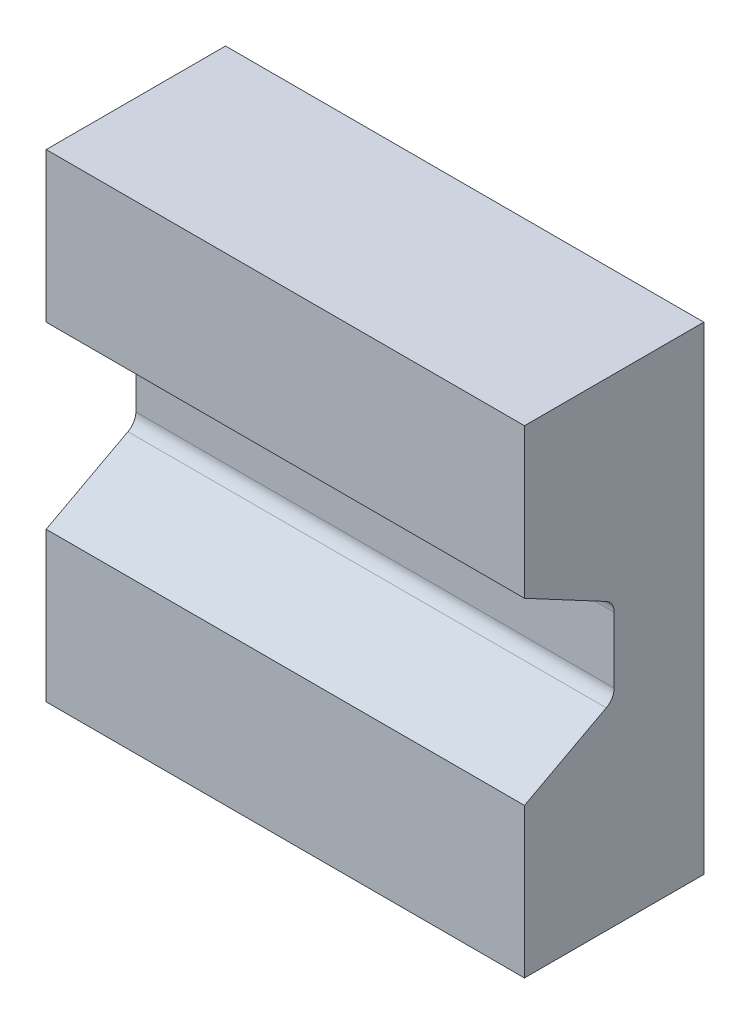
ISO-10303-21;
HEADER;
FILE_DESCRIPTION(('STEP AP214'),'2;1');
FILE_NAME('part.step','',(''),(''),'','','');
FILE_SCHEMA(('AUTOMOTIVE_DESIGN { 1 0 10303 214 1 1 1 1 }'));
ENDSEC;
DATA;
#1=APPLICATION_CONTEXT('core data for automotive mechanical design processes');
#2=APPLICATION_PROTOCOL_DEFINITION('international standard','automotive_design',2000,#1);
#3=PRODUCT_CONTEXT('',#1,'mechanical');
#4=PRODUCT('Part','Part','',(#3));
#5=PRODUCT_RELATED_PRODUCT_CATEGORY('part','',(#4));
#6=PRODUCT_DEFINITION_FORMATION('','',#4);
#7=PRODUCT_DEFINITION_CONTEXT('part definition',#1,'design');
#8=PRODUCT_DEFINITION('design','',#6,#7);
#9=PRODUCT_DEFINITION_SHAPE('','',#8);
#10=(LENGTH_UNIT() NAMED_UNIT(*) SI_UNIT(.MILLI.,.METRE.));
#11=(NAMED_UNIT(*) PLANE_ANGLE_UNIT() SI_UNIT($,.RADIAN.));
#12=(NAMED_UNIT(*) SI_UNIT($,.STERADIAN.) SOLID_ANGLE_UNIT());
#13=UNCERTAINTY_MEASURE_WITH_UNIT(LENGTH_MEASURE(1.E-05),#10,'distance_accuracy_value','');
#14=(GEOMETRIC_REPRESENTATION_CONTEXT(3) GLOBAL_UNCERTAINTY_ASSIGNED_CONTEXT((#13)) GLOBAL_UNIT_ASSIGNED_CONTEXT((#10,
#11,#12)) REPRESENTATION_CONTEXT('',''));
#15=CARTESIAN_POINT('',(0.,0.,0.));
#16=DIRECTION('',(0.,0.,1.));
#17=DIRECTION('',(1.,0.,0.));
#18=AXIS2_PLACEMENT_3D('',#15,#16,#17);
#19=CARTESIAN_POINT('',(-40.,-40.,30.));
#20=DIRECTION('',(0.,0.,1.));
#21=DIRECTION('',(1.,0.,0.));
#22=AXIS2_PLACEMENT_3D('',#19,#20,#21);
#23=PLANE('',#22);
#24=DIRECTION('',(1.,0.,0.));
#25=VECTOR('',#24,1.);
#26=CARTESIAN_POINT('',(-40.,15.,30.));
#27=LINE('',#26,#25);
#28=CARTESIAN_POINT('',(-40.,15.,30.));
#29=VERTEX_POINT('',#28);
#30=CARTESIAN_POINT('',(40.,15.,30.));
#31=VERTEX_POINT('',#30);
#32=EDGE_CURVE('E156',#29,#31,#27,.T.);
#33=ORIENTED_EDGE('',*,*,#32,.T.);
#34=DIRECTION('',(0.,1.,0.));
#35=VECTOR('',#34,1.);
#36=CARTESIAN_POINT('',(40.,40.,30.));
#37=LINE('',#36,#35);
#38=CARTESIAN_POINT('',(40.,40.,30.));
#39=VERTEX_POINT('',#38);
#40=EDGE_CURVE('E170',#31,#39,#37,.T.);
#41=ORIENTED_EDGE('',*,*,#40,.T.);
#42=DIRECTION('',(-1.,0.,0.));
#43=VECTOR('',#42,1.);
#44=CARTESIAN_POINT('',(-40.,40.,30.));
#45=LINE('',#44,#43);
#46=CARTESIAN_POINT('',(-40.,40.,30.));
#47=VERTEX_POINT('',#46);
#48=EDGE_CURVE('E55',#39,#47,#45,.T.);
#49=ORIENTED_EDGE('',*,*,#48,.T.);
#50=DIRECTION('',(0.,-1.,0.));
#51=VECTOR('',#50,1.);
#52=CARTESIAN_POINT('',(-40.,40.,30.));
#53=LINE('',#52,#51);
#54=EDGE_CURVE('E166',#47,#29,#53,.T.);
#55=ORIENTED_EDGE('',*,*,#54,.T.);
#56=EDGE_LOOP('',(#33,#41,#49,#55));
#57=FACE_BOUND('',#56,.T.);
#58=ADVANCED_FACE('F31',(#57),#23,.T.);
#59=CARTESIAN_POINT('',(-40.,40.,30.));
#60=DIRECTION('',(1.,0.,0.));
#61=DIRECTION('',(0.,1.,0.));
#62=AXIS2_PLACEMENT_3D('',#59,#60,#61);
#63=PLANE('',#62);
#64=CARTESIAN_POINT('',(-40.,5.49999999999999,17.5));
#65=DIRECTION('',(1.,0.,0.));
#66=DIRECTION('',(0.,1.,0.));
#67=AXIS2_PLACEMENT_3D('',#64,#65,#66);
#68=CIRCLE('',#67,2.5);
#69=CARTESIAN_POINT('',(-40.,5.49999999999999,15.));
#70=VERTEX_POINT('',#69);
#71=CARTESIAN_POINT('',(-40.,7.70588235294117,16.3235294117647));
#72=VERTEX_POINT('',#71);
#73=EDGE_CURVE('E143',#70,#72,#68,.T.);
#74=ORIENTED_EDGE('',*,*,#73,.T.);
#75=DIRECTION('',(0.,0.470588235294118,0.882352941176471));
#76=VECTOR('',#75,1.);
#77=CARTESIAN_POINT('',(-40.,15.,30.));
#78=LINE('',#77,#76);
#79=EDGE_CURVE('E145',#72,#29,#78,.T.);
#80=ORIENTED_EDGE('',*,*,#79,.T.);
#81=ORIENTED_EDGE('',*,*,#54,.F.);
#82=DIRECTION('',(0.,0.,-1.));
#83=VECTOR('',#82,1.);
#84=CARTESIAN_POINT('',(-40.,40.,30.));
#85=LINE('',#84,#83);
#86=CARTESIAN_POINT('',(-40.,40.,0.));
#87=VERTEX_POINT('',#86);
#88=EDGE_CURVE('E175',#47,#87,#85,.T.);
#89=ORIENTED_EDGE('',*,*,#88,.T.);
#90=DIRECTION('',(0.,-1.,0.));
#91=VECTOR('',#90,1.);
#92=CARTESIAN_POINT('',(-40.,40.,0.));
#93=LINE('',#92,#91);
#94=CARTESIAN_POINT('',(-40.,-40.,0.));
#95=VERTEX_POINT('',#94);
#96=EDGE_CURVE('E159',#87,#95,#93,.T.);
#97=ORIENTED_EDGE('',*,*,#96,.T.);
#98=DIRECTION('',(0.,0.,-1.));
#99=VECTOR('',#98,1.);
#100=CARTESIAN_POINT('',(-40.,-40.,30.));
#101=LINE('',#100,#99);
#102=CARTESIAN_POINT('',(-40.,-40.,30.));
#103=VERTEX_POINT('',#102);
#104=EDGE_CURVE('E11',#103,#95,#101,.T.);
#105=ORIENTED_EDGE('',*,*,#104,.F.);
#106=CARTESIAN_POINT('',(-40.,-15.,30.));
#107=VERTEX_POINT('',#106);
#108=EDGE_CURVE('E83',#107,#103,#53,.T.);
#109=ORIENTED_EDGE('',*,*,#108,.F.);
#110=DIRECTION('',(0.,0.470588235294118,-0.88235294117647));
#111=VECTOR('',#110,1.);
#112=CARTESIAN_POINT('',(-40.,-15.,30.));
#113=LINE('',#112,#111);
#114=CARTESIAN_POINT('',(-40.,-7.70588235294119,16.3235294117647));
#115=VERTEX_POINT('',#114);
#116=EDGE_CURVE('E46',#107,#115,#113,.T.);
#117=ORIENTED_EDGE('',*,*,#116,.T.);
#118=CARTESIAN_POINT('',(-40.,-5.50000000000001,17.5));
#119=DIRECTION('',(1.,0.,0.));
#120=DIRECTION('',(0.,-1.,0.));
#121=AXIS2_PLACEMENT_3D('',#118,#119,#120);
#122=CIRCLE('',#121,2.5);
#123=CARTESIAN_POINT('',(-40.,-5.50000000000001,15.));
#124=VERTEX_POINT('',#123);
#125=EDGE_CURVE('E128',#115,#124,#122,.T.);
#126=ORIENTED_EDGE('',*,*,#125,.T.);
#127=DIRECTION('',(0.,1.,0.));
#128=VECTOR('',#127,1.);
#129=CARTESIAN_POINT('',(-40.,5.49999999999999,15.));
#130=LINE('',#129,#128);
#131=EDGE_CURVE('E133',#124,#70,#130,.T.);
#132=ORIENTED_EDGE('',*,*,#131,.T.);
#133=EDGE_LOOP('',(#74,#80,#81,#89,#97,#105,#109,#117,#126,#132));
#134=FACE_BOUND('',#133,.T.);
#135=ADVANCED_FACE('F33',(#134),#63,.F.);
#136=CARTESIAN_POINT('',(-40.,-40.,30.));
#137=DIRECTION('',(0.,1.,0.));
#138=DIRECTION('',(0.,0.,1.));
#139=AXIS2_PLACEMENT_3D('',#136,#137,#138);
#140=PLANE('',#139);
#141=DIRECTION('',(1.,0.,0.));
#142=VECTOR('',#141,1.);
#143=CARTESIAN_POINT('',(-40.,-40.,0.));
#144=LINE('',#143,#142);
#145=CARTESIAN_POINT('',(40.,-40.,0.));
#146=VERTEX_POINT('',#145);
#147=EDGE_CURVE('E178',#95,#146,#144,.T.);
#148=ORIENTED_EDGE('',*,*,#147,.T.);
#149=DIRECTION('',(0.,0.,-1.));
#150=VECTOR('',#149,1.);
#151=CARTESIAN_POINT('',(40.,-40.,30.));
#152=LINE('',#151,#150);
#153=CARTESIAN_POINT('',(40.,-40.,30.));
#154=VERTEX_POINT('',#153);
#155=EDGE_CURVE('E39',#154,#146,#152,.T.);
#156=ORIENTED_EDGE('',*,*,#155,.F.);
#157=DIRECTION('',(1.,0.,0.));
#158=VECTOR('',#157,1.);
#159=CARTESIAN_POINT('',(-40.,-40.,30.));
#160=LINE('',#159,#158);
#161=EDGE_CURVE('E168',#103,#154,#160,.T.);
#162=ORIENTED_EDGE('',*,*,#161,.F.);
#163=ORIENTED_EDGE('',*,*,#104,.T.);
#164=EDGE_LOOP('',(#148,#156,#162,#163));
#165=FACE_BOUND('',#164,.T.);
#166=ADVANCED_FACE('F224',(#165),#140,.F.);
#167=CARTESIAN_POINT('',(40.,40.,30.));
#168=DIRECTION('',(-1.,0.,0.));
#169=DIRECTION('',(0.,-1.,0.));
#170=AXIS2_PLACEMENT_3D('',#167,#168,#169);
#171=PLANE('',#170);
#172=ORIENTED_EDGE('',*,*,#40,.F.);
#173=DIRECTION('',(0.,0.470588235294118,0.882352941176471));
#174=VECTOR('',#173,1.);
#175=CARTESIAN_POINT('',(40.,15.,30.));
#176=LINE('',#175,#174);
#177=CARTESIAN_POINT('',(40.,7.70588235294118,16.3235294117647));
#178=VERTEX_POINT('',#177);
#179=EDGE_CURVE('E137',#178,#31,#176,.T.);
#180=ORIENTED_EDGE('',*,*,#179,.F.);
#181=CARTESIAN_POINT('',(40.,5.5,17.5));
#182=DIRECTION('',(1.,0.,0.));
#183=DIRECTION('',(0.,1.,0.));
#184=AXIS2_PLACEMENT_3D('',#181,#182,#183);
#185=CIRCLE('',#184,2.5);
#186=CARTESIAN_POINT('',(40.,5.5,15.));
#187=VERTEX_POINT('',#186);
#188=EDGE_CURVE('E139',#187,#178,#185,.T.);
#189=ORIENTED_EDGE('',*,*,#188,.F.);
#190=DIRECTION('',(0.,1.,0.));
#191=VECTOR('',#190,1.);
#192=CARTESIAN_POINT('',(40.,5.5,15.));
#193=LINE('',#192,#191);
#194=CARTESIAN_POINT('',(40.,-5.5,15.));
#195=VERTEX_POINT('',#194);
#196=EDGE_CURVE('E151',#195,#187,#193,.T.);
#197=ORIENTED_EDGE('',*,*,#196,.F.);
#198=CARTESIAN_POINT('',(40.,-5.5,17.5));
#199=DIRECTION('',(1.,0.,0.));
#200=DIRECTION('',(0.,-1.,0.));
#201=AXIS2_PLACEMENT_3D('',#198,#199,#200);
#202=CIRCLE('',#201,2.5);
#203=CARTESIAN_POINT('',(40.,-7.70588235294117,16.3235294117647));
#204=VERTEX_POINT('',#203);
#205=EDGE_CURVE('E149',#204,#195,#202,.T.);
#206=ORIENTED_EDGE('',*,*,#205,.F.);
#207=DIRECTION('',(0.,0.470588235294118,-0.88235294117647));
#208=VECTOR('',#207,1.);
#209=CARTESIAN_POINT('',(40.,-15.,30.));
#210=LINE('',#209,#208);
#211=CARTESIAN_POINT('',(40.,-15.,30.));
#212=VERTEX_POINT('',#211);
#213=EDGE_CURVE('E120',#212,#204,#210,.T.);
#214=ORIENTED_EDGE('',*,*,#213,.F.);
#215=EDGE_CURVE('E171',#154,#212,#37,.T.);
#216=ORIENTED_EDGE('',*,*,#215,.F.);
#217=ORIENTED_EDGE('',*,*,#155,.T.);
#218=DIRECTION('',(0.,1.,0.));
#219=VECTOR('',#218,1.);
#220=CARTESIAN_POINT('',(40.,40.,0.));
#221=LINE('',#220,#219);
#222=CARTESIAN_POINT('',(40.,40.,0.));
#223=VERTEX_POINT('',#222);
#224=EDGE_CURVE('E180',#146,#223,#221,.T.);
#225=ORIENTED_EDGE('',*,*,#224,.T.);
#226=DIRECTION('',(0.,0.,-1.));
#227=VECTOR('',#226,1.);
#228=CARTESIAN_POINT('',(40.,40.,30.));
#229=LINE('',#228,#227);
#230=EDGE_CURVE('E184',#39,#223,#229,.T.);
#231=ORIENTED_EDGE('',*,*,#230,.F.);
#232=EDGE_LOOP('',(#172,#180,#189,#197,#206,#214,#216,#217,#225,#231));
#233=FACE_BOUND('',#232,.T.);
#234=ADVANCED_FACE('F191',(#233),#171,.F.);
#235=CARTESIAN_POINT('',(-40.,40.,30.));
#236=DIRECTION('',(0.,-1.,0.));
#237=DIRECTION('',(0.,0.,-1.));
#238=AXIS2_PLACEMENT_3D('',#235,#236,#237);
#239=PLANE('',#238);
#240=DIRECTION('',(-1.,0.,0.));
#241=VECTOR('',#240,1.);
#242=CARTESIAN_POINT('',(-40.,40.,0.));
#243=LINE('',#242,#241);
#244=EDGE_CURVE('E76',#223,#87,#243,.T.);
#245=ORIENTED_EDGE('',*,*,#244,.T.);
#246=ORIENTED_EDGE('',*,*,#88,.F.);
#247=ORIENTED_EDGE('',*,*,#48,.F.);
#248=ORIENTED_EDGE('',*,*,#230,.T.);
#249=EDGE_LOOP('',(#245,#246,#247,#248));
#250=FACE_BOUND('',#249,.T.);
#251=ADVANCED_FACE('F198',(#250),#239,.F.);
#252=DIRECTION('',(1.,0.,0.));
#253=VECTOR('',#252,1.);
#254=CARTESIAN_POINT('',(-40.,-15.,30.));
#255=LINE('',#254,#253);
#256=EDGE_CURVE('E125',#107,#212,#255,.T.);
#257=ORIENTED_EDGE('',*,*,#256,.F.);
#258=ORIENTED_EDGE('',*,*,#108,.T.);
#259=ORIENTED_EDGE('',*,*,#161,.T.);
#260=ORIENTED_EDGE('',*,*,#215,.T.);
#261=EDGE_LOOP('',(#257,#258,#259,#260));
#262=FACE_BOUND('',#261,.T.);
#263=ADVANCED_FACE('F220',(#262),#23,.T.);
#264=CARTESIAN_POINT('',(-40.,-40.,0.));
#265=DIRECTION('',(0.,0.,1.));
#266=DIRECTION('',(1.,0.,0.));
#267=AXIS2_PLACEMENT_3D('',#264,#265,#266);
#268=PLANE('',#267);
#269=ORIENTED_EDGE('',*,*,#96,.F.);
#270=ORIENTED_EDGE('',*,*,#244,.F.);
#271=ORIENTED_EDGE('',*,*,#224,.F.);
#272=ORIENTED_EDGE('',*,*,#147,.F.);
#273=EDGE_LOOP('',(#269,#270,#271,#272));
#274=FACE_BOUND('',#273,.T.);
#275=ADVANCED_FACE('F196',(#274),#268,.F.);
#276=CARTESIAN_POINT('',(-40.,15.,30.));
#277=DIRECTION('',(0.,0.88235294117647,-0.470588235294118));
#278=DIRECTION('',(0.,0.470588235294118,0.882352941176471));
#279=AXIS2_PLACEMENT_3D('',#276,#277,#278);
#280=PLANE('',#279);
#281=ORIENTED_EDGE('',*,*,#179,.T.);
#282=ORIENTED_EDGE('',*,*,#32,.F.);
#283=ORIENTED_EDGE('',*,*,#79,.F.);
#284=DIRECTION('',(1.,0.,0.));
#285=VECTOR('',#284,1.);
#286=CARTESIAN_POINT('',(-40.,7.70588235294117,16.3235294117647));
#287=LINE('',#286,#285);
#288=EDGE_CURVE('E160',#72,#178,#287,.T.);
#289=ORIENTED_EDGE('',*,*,#288,.T.);
#290=EDGE_LOOP('',(#281,#282,#283,#289));
#291=FACE_BOUND('',#290,.T.);
#292=ADVANCED_FACE('F203',(#291),#280,.F.);
#293=CARTESIAN_POINT('',(-40.,5.49999999999999,17.5));
#294=DIRECTION('',(1.,0.,0.));
#295=DIRECTION('',(0.,1.,0.));
#296=AXIS2_PLACEMENT_3D('',#293,#294,#295);
#297=CYLINDRICAL_SURFACE('',#296,2.5);
#298=ORIENTED_EDGE('',*,*,#188,.T.);
#299=ORIENTED_EDGE('',*,*,#288,.F.);
#300=ORIENTED_EDGE('',*,*,#73,.F.);
#301=DIRECTION('',(1.,0.,0.));
#302=VECTOR('',#301,1.);
#303=CARTESIAN_POINT('',(-40.,5.49999999999999,15.));
#304=LINE('',#303,#302);
#305=EDGE_CURVE('E162',#70,#187,#304,.T.);
#306=ORIENTED_EDGE('',*,*,#305,.T.);
#307=EDGE_LOOP('',(#298,#299,#300,#306));
#308=FACE_BOUND('',#307,.T.);
#309=ADVANCED_FACE('F206',(#308),#297,.F.);
#310=CARTESIAN_POINT('',(-40.,5.49999999999999,15.));
#311=DIRECTION('',(0.,0.,-1.));
#312=DIRECTION('',(0.,1.,0.));
#313=AXIS2_PLACEMENT_3D('',#310,#311,#312);
#314=PLANE('',#313);
#315=ORIENTED_EDGE('',*,*,#196,.T.);
#316=ORIENTED_EDGE('',*,*,#305,.F.);
#317=ORIENTED_EDGE('',*,*,#131,.F.);
#318=DIRECTION('',(1.,0.,0.));
#319=VECTOR('',#318,1.);
#320=CARTESIAN_POINT('',(-40.,-5.50000000000001,15.));
#321=LINE('',#320,#319);
#322=EDGE_CURVE('E124',#124,#195,#321,.T.);
#323=ORIENTED_EDGE('',*,*,#322,.T.);
#324=EDGE_LOOP('',(#315,#316,#317,#323));
#325=FACE_BOUND('',#324,.T.);
#326=ADVANCED_FACE('F209',(#325),#314,.F.);
#327=CARTESIAN_POINT('',(-40.,-5.50000000000001,17.5));
#328=DIRECTION('',(1.,0.,0.));
#329=DIRECTION('',(0.,1.,0.));
#330=AXIS2_PLACEMENT_3D('',#327,#328,#329);
#331=CYLINDRICAL_SURFACE('',#330,2.5);
#332=ORIENTED_EDGE('',*,*,#205,.T.);
#333=ORIENTED_EDGE('',*,*,#322,.F.);
#334=ORIENTED_EDGE('',*,*,#125,.F.);
#335=DIRECTION('',(1.,0.,0.));
#336=VECTOR('',#335,1.);
#337=CARTESIAN_POINT('',(-40.,-7.70588235294119,16.3235294117647));
#338=LINE('',#337,#336);
#339=EDGE_CURVE('E116',#115,#204,#338,.T.);
#340=ORIENTED_EDGE('',*,*,#339,.T.);
#341=EDGE_LOOP('',(#332,#333,#334,#340));
#342=FACE_BOUND('',#341,.T.);
#343=ADVANCED_FACE('F129',(#342),#331,.F.);
#344=CARTESIAN_POINT('',(-40.,-15.,30.));
#345=DIRECTION('',(0.,-0.88235294117647,-0.470588235294118));
#346=DIRECTION('',(0.,0.470588235294118,-0.88235294117647));
#347=AXIS2_PLACEMENT_3D('',#344,#345,#346);
#348=PLANE('',#347);
#349=ORIENTED_EDGE('',*,*,#213,.T.);
#350=ORIENTED_EDGE('',*,*,#339,.F.);
#351=ORIENTED_EDGE('',*,*,#116,.F.);
#352=ORIENTED_EDGE('',*,*,#256,.T.);
#353=EDGE_LOOP('',(#349,#350,#351,#352));
#354=FACE_BOUND('',#353,.T.);
#355=ADVANCED_FACE('F118',(#354),#348,.F.);
#356=CLOSED_SHELL('',(#58,#135,#166,#234,#251,#263,#275,#292,#309,#326,#343,#355));
#357=MANIFOLD_SOLID_BREP('B2',#356);
#358=ADVANCED_BREP_SHAPE_REPRESENTATION('',(#18,#357),#14);
#359=SHAPE_DEFINITION_REPRESENTATION(#9,#358);
ENDSEC;
END-ISO-10303-21;
